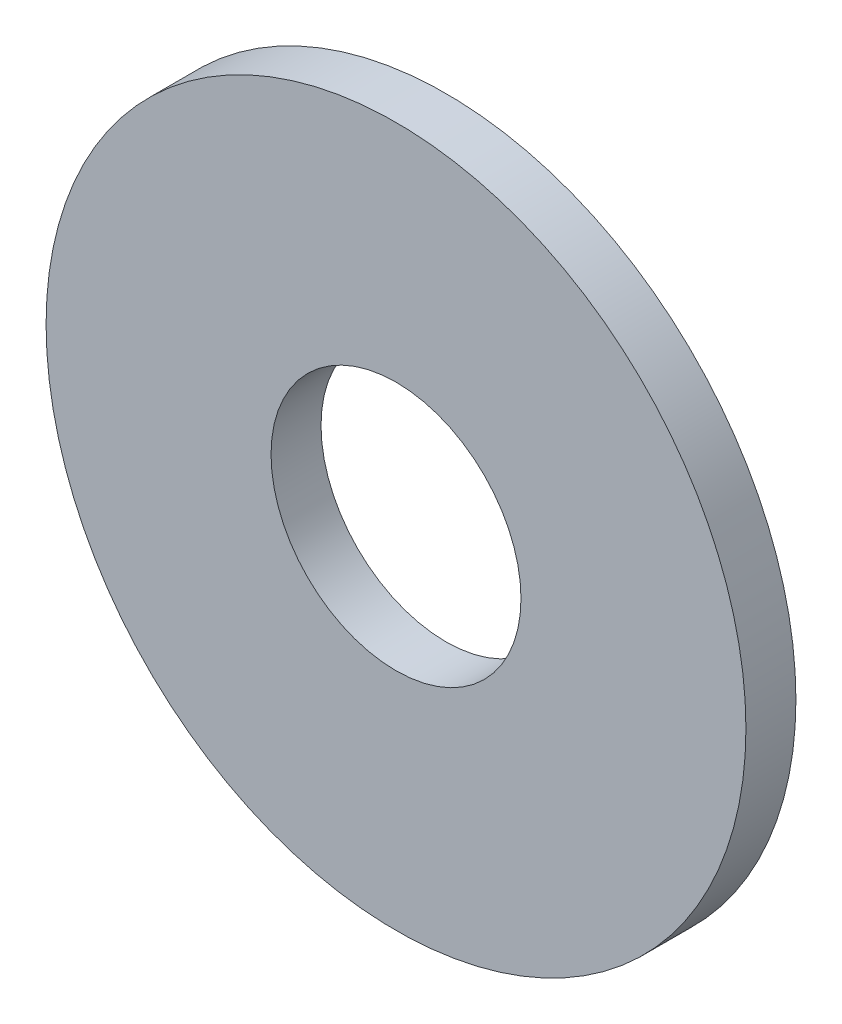
ISO-10303-21;
HEADER;
FILE_DESCRIPTION(('STEP AP214'),'2;1');
FILE_NAME('part.step','',(''),(''),'','','');
FILE_SCHEMA(('AUTOMOTIVE_DESIGN { 1 0 10303 214 1 1 1 1 }'));
ENDSEC;
DATA;
#1=APPLICATION_CONTEXT('core data for automotive mechanical design processes');
#2=APPLICATION_PROTOCOL_DEFINITION('international standard','automotive_design',2000,#1);
#3=PRODUCT_CONTEXT('',#1,'mechanical');
#4=PRODUCT('Part','Part','',(#3));
#5=PRODUCT_RELATED_PRODUCT_CATEGORY('part','',(#4));
#6=PRODUCT_DEFINITION_FORMATION('','',#4);
#7=PRODUCT_DEFINITION_CONTEXT('part definition',#1,'design');
#8=PRODUCT_DEFINITION('design','',#6,#7);
#9=PRODUCT_DEFINITION_SHAPE('','',#8);
#10=(LENGTH_UNIT() NAMED_UNIT(*) SI_UNIT(.MILLI.,.METRE.));
#11=(NAMED_UNIT(*) PLANE_ANGLE_UNIT() SI_UNIT($,.RADIAN.));
#12=(NAMED_UNIT(*) SI_UNIT($,.STERADIAN.) SOLID_ANGLE_UNIT());
#13=UNCERTAINTY_MEASURE_WITH_UNIT(LENGTH_MEASURE(1.E-05),#10,'distance_accuracy_value','');
#14=(GEOMETRIC_REPRESENTATION_CONTEXT(3) GLOBAL_UNCERTAINTY_ASSIGNED_CONTEXT((#13)) GLOBAL_UNIT_ASSIGNED_CONTEXT((#10,
#11,#12)) REPRESENTATION_CONTEXT('',''));
#15=CARTESIAN_POINT('',(0.,0.,0.));
#16=DIRECTION('',(0.,0.,1.));
#17=DIRECTION('',(1.,0.,0.));
#18=AXIS2_PLACEMENT_3D('',#15,#16,#17);
#19=CARTESIAN_POINT('',(2.66453525910038E-12,1.33226762955019E-12,2.0000000000211));
#20=DIRECTION('',(0.,0.,1.));
#21=DIRECTION('',(0.999999999999999,0.,0.));
#22=AXIS2_PLACEMENT_3D('',#19,#20,#21);
#23=PLANE('',#22);
#24=CARTESIAN_POINT('',(2.66453525910038E-12,1.33226762955019E-12,2.0000000000211));
#25=DIRECTION('',(0.,0.,1.));
#26=DIRECTION('',(0.999999999999999,0.,0.));
#27=AXIS2_PLACEMENT_3D('',#24,#25,#26);
#28=CIRCLE('',#27,14.);
#29=CARTESIAN_POINT('',(14.0000000000027,1.33886936537757E-12,2.0000000000211));
#30=VERTEX_POINT('',#29);
#31=EDGE_CURVE('E10',#30,#30,#28,.T.);
#32=ORIENTED_EDGE('',*,*,#31,.T.);
#33=EDGE_LOOP('',(#32));
#34=FACE_BOUND('',#33,.T.);
#35=CARTESIAN_POINT('',(2.66453525910038E-12,1.33226762955019E-12,2.0000000000211));
#36=DIRECTION('',(0.,0.,1.));
#37=DIRECTION('',(0.999999999999999,0.,0.));
#38=AXIS2_PLACEMENT_3D('',#35,#36,#37);
#39=CIRCLE('',#38,5.);
#40=CARTESIAN_POINT('',(5.00000000000266,1.33462539234568E-12,2.0000000000211));
#41=VERTEX_POINT('',#40);
#42=EDGE_CURVE('E41',#41,#41,#39,.T.);
#43=ORIENTED_EDGE('',*,*,#42,.F.);
#44=EDGE_LOOP('',(#43));
#45=FACE_BOUND('',#44,.T.);
#46=ADVANCED_FACE('F30',(#34,#45),#23,.T.);
#47=CARTESIAN_POINT('',(0.,0.,0.));
#48=DIRECTION('',(0.,0.,1.));
#49=DIRECTION('',(0.999999999999999,0.,0.));
#50=AXIS2_PLACEMENT_3D('',#47,#48,#49);
#51=PLANE('',#50);
#52=CARTESIAN_POINT('',(0.,0.,0.));
#53=DIRECTION('',(0.,0.,1.));
#54=DIRECTION('',(0.999999999999999,0.,0.));
#55=AXIS2_PLACEMENT_3D('',#52,#53,#54);
#56=CIRCLE('',#55,14.);
#57=CARTESIAN_POINT('',(14.,0.,0.));
#58=VERTEX_POINT('',#57);
#59=EDGE_CURVE('E34',#58,#58,#56,.T.);
#60=ORIENTED_EDGE('',*,*,#59,.F.);
#61=EDGE_LOOP('',(#60));
#62=FACE_BOUND('',#61,.T.);
#63=CARTESIAN_POINT('',(0.,0.,0.));
#64=DIRECTION('',(0.,0.,1.));
#65=DIRECTION('',(0.999999999999999,0.,0.));
#66=AXIS2_PLACEMENT_3D('',#63,#64,#65);
#67=CIRCLE('',#66,5.);
#68=CARTESIAN_POINT('',(5.,0.,0.));
#69=VERTEX_POINT('',#68);
#70=EDGE_CURVE('E43',#69,#69,#67,.T.);
#71=ORIENTED_EDGE('',*,*,#70,.T.);
#72=EDGE_LOOP('',(#71));
#73=FACE_BOUND('',#72,.T.);
#74=ADVANCED_FACE('F53',(#62,#73),#51,.F.);
#75=CARTESIAN_POINT('',(2.66453525910038E-12,1.33226762955019E-12,2.0000000000211));
#76=DIRECTION('',(0.,0.,-1.));
#77=DIRECTION('',(-0.999999999999999,0.,0.));
#78=AXIS2_PLACEMENT_3D('',#75,#76,#77);
#79=CYLINDRICAL_SURFACE('',#78,14.);
#80=ORIENTED_EDGE('',*,*,#31,.F.);
#81=EDGE_LOOP('',(#80));
#82=FACE_BOUND('',#81,.T.);
#83=ORIENTED_EDGE('',*,*,#59,.T.);
#84=EDGE_LOOP('',(#83));
#85=FACE_BOUND('',#84,.T.);
#86=ADVANCED_FACE('F32',(#82,#85),#79,.T.);
#87=CARTESIAN_POINT('',(2.66453525910038E-12,1.33226762955019E-12,2.0000000000211));
#88=DIRECTION('',(0.,0.,-1.));
#89=DIRECTION('',(-0.999999999999999,0.,0.));
#90=AXIS2_PLACEMENT_3D('',#87,#88,#89);
#91=CYLINDRICAL_SURFACE('',#90,5.);
#92=ORIENTED_EDGE('',*,*,#42,.T.);
#93=EDGE_LOOP('',(#92));
#94=FACE_BOUND('',#93,.T.);
#95=ORIENTED_EDGE('',*,*,#70,.F.);
#96=EDGE_LOOP('',(#95));
#97=FACE_BOUND('',#96,.T.);
#98=ADVANCED_FACE('F49',(#94,#97),#91,.F.);
#99=CLOSED_SHELL('',(#46,#74,#86,#98));
#100=MANIFOLD_SOLID_BREP('B2',#99);
#101=ADVANCED_BREP_SHAPE_REPRESENTATION('',(#18,#100),#14);
#102=SHAPE_DEFINITION_REPRESENTATION(#9,#101);
ENDSEC;
END-ISO-10303-21;
